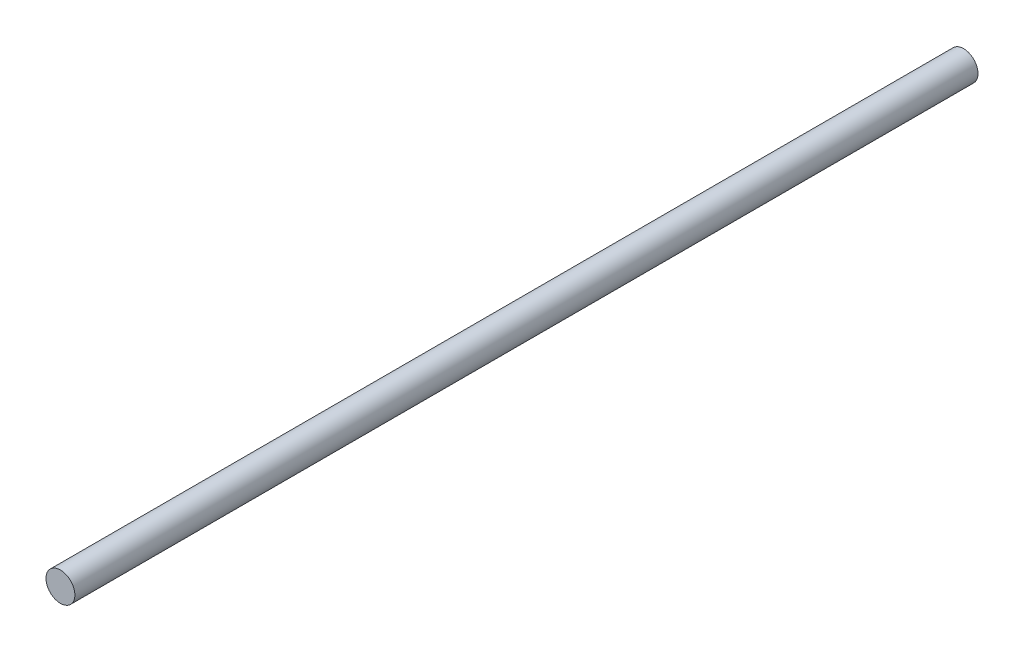
ISO-10303-21;
HEADER;
FILE_DESCRIPTION(('STEP AP214'),'2;1');
FILE_NAME('part.step','',(''),(''),'','','');
FILE_SCHEMA(('AUTOMOTIVE_DESIGN { 1 0 10303 214 1 1 1 1 }'));
ENDSEC;
DATA;
#1=APPLICATION_CONTEXT('core data for automotive mechanical design processes');
#2=APPLICATION_PROTOCOL_DEFINITION('international standard','automotive_design',2000,#1);
#3=PRODUCT_CONTEXT('',#1,'mechanical');
#4=PRODUCT('Part','Part','',(#3));
#5=PRODUCT_RELATED_PRODUCT_CATEGORY('part','',(#4));
#6=PRODUCT_DEFINITION_FORMATION('','',#4);
#7=PRODUCT_DEFINITION_CONTEXT('part definition',#1,'design');
#8=PRODUCT_DEFINITION('design','',#6,#7);
#9=PRODUCT_DEFINITION_SHAPE('','',#8);
#10=(LENGTH_UNIT() NAMED_UNIT(*) SI_UNIT(.MILLI.,.METRE.));
#11=(NAMED_UNIT(*) PLANE_ANGLE_UNIT() SI_UNIT($,.RADIAN.));
#12=(NAMED_UNIT(*) SI_UNIT($,.STERADIAN.) SOLID_ANGLE_UNIT());
#13=UNCERTAINTY_MEASURE_WITH_UNIT(LENGTH_MEASURE(1.E-05),#10,'distance_accuracy_value','');
#14=(GEOMETRIC_REPRESENTATION_CONTEXT(3) GLOBAL_UNCERTAINTY_ASSIGNED_CONTEXT((#13)) GLOBAL_UNIT_ASSIGNED_CONTEXT((#10,
#11,#12)) REPRESENTATION_CONTEXT('',''));
#15=CARTESIAN_POINT('',(0.,0.,0.));
#16=DIRECTION('',(0.,0.,1.));
#17=DIRECTION('',(1.,0.,0.));
#18=AXIS2_PLACEMENT_3D('',#15,#16,#17);
#19=CARTESIAN_POINT('',(0.,0.,375.));
#20=DIRECTION('',(0.,0.,-1.));
#21=DIRECTION('',(-1.,0.,0.));
#22=AXIS2_PLACEMENT_3D('',#19,#20,#21);
#23=CYLINDRICAL_SURFACE('',#22,6.);
#24=CARTESIAN_POINT('',(0.,0.,375.));
#25=DIRECTION('',(0.,0.,1.));
#26=DIRECTION('',(1.,0.,0.));
#27=AXIS2_PLACEMENT_3D('',#24,#25,#26);
#28=CIRCLE('',#27,6.);
#29=CARTESIAN_POINT('',(6.,0.,375.));
#30=VERTEX_POINT('',#29);
#31=EDGE_CURVE('E10',#30,#30,#28,.T.);
#32=ORIENTED_EDGE('',*,*,#31,.F.);
#33=EDGE_LOOP('',(#32));
#34=FACE_BOUND('',#33,.T.);
#35=CARTESIAN_POINT('',(0.,0.,0.));
#36=DIRECTION('',(0.,0.,1.));
#37=DIRECTION('',(1.,0.,0.));
#38=AXIS2_PLACEMENT_3D('',#35,#36,#37);
#39=CIRCLE('',#38,6.);
#40=CARTESIAN_POINT('',(6.,0.,0.));
#41=VERTEX_POINT('',#40);
#42=EDGE_CURVE('E36',#41,#41,#39,.T.);
#43=ORIENTED_EDGE('',*,*,#42,.T.);
#44=EDGE_LOOP('',(#43));
#45=FACE_BOUND('',#44,.T.);
#46=ADVANCED_FACE('F33',(#34,#45),#23,.T.);
#47=CARTESIAN_POINT('',(0.,0.,375.));
#48=DIRECTION('',(0.,0.,1.));
#49=DIRECTION('',(1.,0.,0.));
#50=AXIS2_PLACEMENT_3D('',#47,#48,#49);
#51=PLANE('',#50);
#52=ORIENTED_EDGE('',*,*,#31,.T.);
#53=EDGE_LOOP('',(#52));
#54=FACE_BOUND('',#53,.T.);
#55=ADVANCED_FACE('F48',(#54),#51,.T.);
#56=CARTESIAN_POINT('',(0.,0.,0.));
#57=DIRECTION('',(0.,0.,1.));
#58=DIRECTION('',(1.,0.,0.));
#59=AXIS2_PLACEMENT_3D('',#56,#57,#58);
#60=PLANE('',#59);
#61=ORIENTED_EDGE('',*,*,#42,.F.);
#62=EDGE_LOOP('',(#61));
#63=FACE_BOUND('',#62,.T.);
#64=ADVANCED_FACE('F46',(#63),#60,.F.);
#65=CLOSED_SHELL('',(#46,#55,#64));
#66=MANIFOLD_SOLID_BREP('B2',#65);
#67=ADVANCED_BREP_SHAPE_REPRESENTATION('',(#18,#66),#14);
#68=SHAPE_DEFINITION_REPRESENTATION(#9,#67);
ENDSEC;
END-ISO-10303-21;
